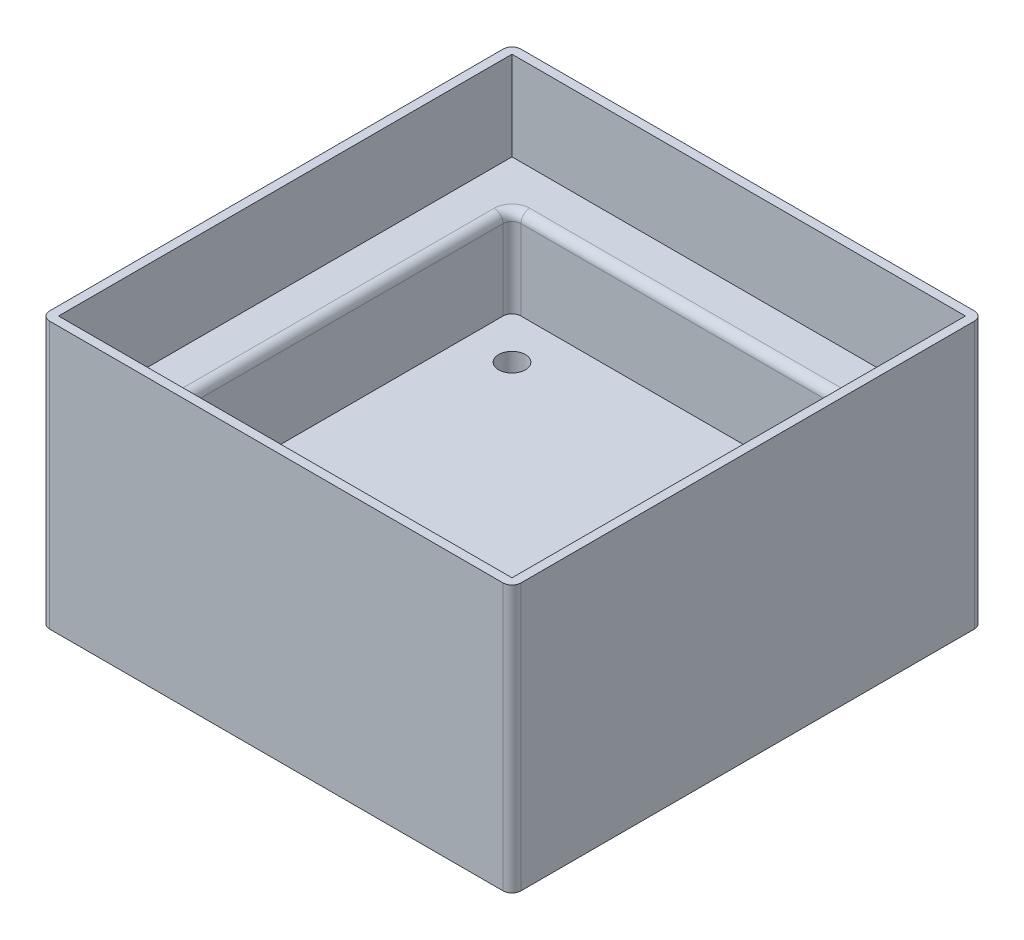
ISO-10303-21;
HEADER;
FILE_DESCRIPTION(('STEP AP214'),'2;1');
FILE_NAME('part.step','',(''),(''),'','','');
FILE_SCHEMA(('AUTOMOTIVE_DESIGN { 1 0 10303 214 1 1 1 1 }'));
ENDSEC;
DATA;
#1=APPLICATION_CONTEXT('core data for automotive mechanical design processes');
#2=APPLICATION_PROTOCOL_DEFINITION('international standard','automotive_design',2000,#1);
#3=PRODUCT_CONTEXT('',#1,'mechanical');
#4=PRODUCT('Part','Part','',(#3));
#5=PRODUCT_RELATED_PRODUCT_CATEGORY('part','',(#4));
#6=PRODUCT_DEFINITION_FORMATION('','',#4);
#7=PRODUCT_DEFINITION_CONTEXT('part definition',#1,'design');
#8=PRODUCT_DEFINITION('design','',#6,#7);
#9=PRODUCT_DEFINITION_SHAPE('','',#8);
#10=(LENGTH_UNIT() NAMED_UNIT(*) SI_UNIT(.MILLI.,.METRE.));
#11=(NAMED_UNIT(*) PLANE_ANGLE_UNIT() SI_UNIT($,.RADIAN.));
#12=(NAMED_UNIT(*) SI_UNIT($,.STERADIAN.) SOLID_ANGLE_UNIT());
#13=UNCERTAINTY_MEASURE_WITH_UNIT(LENGTH_MEASURE(1.E-05),#10,'distance_accuracy_value','');
#14=(GEOMETRIC_REPRESENTATION_CONTEXT(3) GLOBAL_UNCERTAINTY_ASSIGNED_CONTEXT((#13)) GLOBAL_UNIT_ASSIGNED_CONTEXT((#10,
#11,#12)) REPRESENTATION_CONTEXT('',''));
#15=CARTESIAN_POINT('',(0.,0.,0.));
#16=DIRECTION('',(0.,0.,1.));
#17=DIRECTION('',(1.,0.,0.));
#18=AXIS2_PLACEMENT_3D('',#15,#16,#17);
#19=CARTESIAN_POINT('',(0.,20.,0.));
#20=DIRECTION('',(0.,1.,0.));
#21=DIRECTION('',(0.,0.,1.));
#22=AXIS2_PLACEMENT_3D('',#19,#20,#21);
#23=PLANE('',#22);
#24=DIRECTION('',(0.,0.,1.));
#25=VECTOR('',#24,1.);
#26=CARTESIAN_POINT('',(0.999999999999999,20.,1.));
#27=LINE('',#26,#25);
#28=CARTESIAN_POINT('',(0.999999999999999,20.,1.));
#29=VERTEX_POINT('',#28);
#30=CARTESIAN_POINT('',(1.00000000000001,20.,52.));
#31=VERTEX_POINT('',#30);
#32=EDGE_CURVE('E200',#29,#31,#27,.T.);
#33=ORIENTED_EDGE('',*,*,#32,.T.);
#34=DIRECTION('',(1.,0.,0.));
#35=VECTOR('',#34,1.);
#36=CARTESIAN_POINT('',(1.00000000000001,20.,52.));
#37=LINE('',#36,#35);
#38=CARTESIAN_POINT('',(52.,20.,52.));
#39=VERTEX_POINT('',#38);
#40=EDGE_CURVE('E211',#31,#39,#37,.T.);
#41=ORIENTED_EDGE('',*,*,#40,.T.);
#42=DIRECTION('',(0.,0.,-1.));
#43=VECTOR('',#42,1.);
#44=CARTESIAN_POINT('',(52.,20.,1.));
#45=LINE('',#44,#43);
#46=CARTESIAN_POINT('',(52.,20.,1.));
#47=VERTEX_POINT('',#46);
#48=EDGE_CURVE('E216',#39,#47,#45,.T.);
#49=ORIENTED_EDGE('',*,*,#48,.T.);
#50=DIRECTION('',(-1.,0.,0.));
#51=VECTOR('',#50,1.);
#52=CARTESIAN_POINT('',(0.999999999999999,20.,1.));
#53=LINE('',#52,#51);
#54=EDGE_CURVE('E208',#47,#29,#53,.T.);
#55=ORIENTED_EDGE('',*,*,#54,.T.);
#56=EDGE_LOOP('',(#33,#41,#49,#55));
#57=FACE_BOUND('',#56,.T.);
#58=CARTESIAN_POINT('',(46.,20.,46.));
#59=DIRECTION('',(0.,1.,0.));
#60=DIRECTION('',(0.,0.,1.));
#61=AXIS2_PLACEMENT_3D('',#58,#59,#60);
#62=CIRCLE('',#61,2.);
#63=CARTESIAN_POINT('',(46.,20.,48.));
#64=VERTEX_POINT('',#63);
#65=CARTESIAN_POINT('',(48.,20.,46.));
#66=VERTEX_POINT('',#65);
#67=EDGE_CURVE('E312',#64,#66,#62,.T.);
#68=ORIENTED_EDGE('',*,*,#67,.F.);
#69=DIRECTION('',(1.,0.,0.));
#70=VECTOR('',#69,1.);
#71=CARTESIAN_POINT('',(6.00000000000001,20.,48.));
#72=LINE('',#71,#70);
#73=CARTESIAN_POINT('',(7.00000000000001,20.,48.));
#74=VERTEX_POINT('',#73);
#75=EDGE_CURVE('E309',#64,#74,#72,.F.);
#76=ORIENTED_EDGE('',*,*,#75,.T.);
#77=CARTESIAN_POINT('',(7.00000000000001,20.,46.));
#78=DIRECTION('',(0.,1.,0.));
#79=DIRECTION('',(0.,0.,1.));
#80=AXIS2_PLACEMENT_3D('',#77,#78,#79);
#81=CIRCLE('',#80,2.);
#82=CARTESIAN_POINT('',(5.00000000000001,20.,46.));
#83=VERTEX_POINT('',#82);
#84=EDGE_CURVE('E307',#83,#74,#81,.T.);
#85=ORIENTED_EDGE('',*,*,#84,.F.);
#86=DIRECTION('',(0.,0.,1.));
#87=VECTOR('',#86,1.);
#88=CARTESIAN_POINT('',(5.,20.,6.));
#89=LINE('',#88,#87);
#90=CARTESIAN_POINT('',(5.,20.,7.));
#91=VERTEX_POINT('',#90);
#92=EDGE_CURVE('E303',#83,#91,#89,.F.);
#93=ORIENTED_EDGE('',*,*,#92,.T.);
#94=CARTESIAN_POINT('',(7.,20.,7.));
#95=DIRECTION('',(0.,1.,0.));
#96=DIRECTION('',(0.,0.,1.));
#97=AXIS2_PLACEMENT_3D('',#94,#95,#96);
#98=CIRCLE('',#97,2.);
#99=CARTESIAN_POINT('',(7.,20.,5.));
#100=VERTEX_POINT('',#99);
#101=EDGE_CURVE('E300',#100,#91,#98,.T.);
#102=ORIENTED_EDGE('',*,*,#101,.F.);
#103=DIRECTION('',(-1.,0.,0.));
#104=VECTOR('',#103,1.);
#105=CARTESIAN_POINT('',(47.,20.,5.));
#106=LINE('',#105,#104);
#107=CARTESIAN_POINT('',(46.,20.,5.));
#108=VERTEX_POINT('',#107);
#109=EDGE_CURVE('E298',#100,#108,#106,.F.);
#110=ORIENTED_EDGE('',*,*,#109,.T.);
#111=CARTESIAN_POINT('',(46.,20.,7.));
#112=DIRECTION('',(0.,1.,0.));
#113=DIRECTION('',(0.,0.,1.));
#114=AXIS2_PLACEMENT_3D('',#111,#112,#113);
#115=CIRCLE('',#114,2.);
#116=CARTESIAN_POINT('',(48.,20.,7.));
#117=VERTEX_POINT('',#116);
#118=EDGE_CURVE('E295',#117,#108,#115,.T.);
#119=ORIENTED_EDGE('',*,*,#118,.F.);
#120=DIRECTION('',(0.,0.,-1.));
#121=VECTOR('',#120,1.);
#122=CARTESIAN_POINT('',(48.,20.,47.));
#123=LINE('',#122,#121);
#124=EDGE_CURVE('E305',#117,#66,#123,.F.);
#125=ORIENTED_EDGE('',*,*,#124,.T.);
#126=EDGE_LOOP('',(#68,#76,#85,#93,#102,#110,#119,#125));
#127=FACE_BOUND('',#126,.T.);
#128=ADVANCED_FACE('F33',(#57,#127),#23,.T.);
#129=CARTESIAN_POINT('',(0.,30.,0.));
#130=DIRECTION('',(1.,0.,0.));
#131=DIRECTION('',(0.,0.,-1.));
#132=AXIS2_PLACEMENT_3D('',#129,#130,#131);
#133=PLANE('',#132);
#134=DIRECTION('',(0.,0.,1.));
#135=VECTOR('',#134,1.);
#136=CARTESIAN_POINT('',(0.,30.,0.));
#137=LINE('',#136,#135);
#138=CARTESIAN_POINT('',(0.,30.,1.));
#139=VERTEX_POINT('',#138);
#140=CARTESIAN_POINT('',(0.,30.,52.));
#141=VERTEX_POINT('',#140);
#142=EDGE_CURVE('E242',#139,#141,#137,.T.);
#143=ORIENTED_EDGE('',*,*,#142,.F.);
#144=DIRECTION('',(0.,-1.,0.));
#145=VECTOR('',#144,1.);
#146=CARTESIAN_POINT('',(0.,30.,1.));
#147=LINE('',#146,#145);
#148=CARTESIAN_POINT('',(0.,0.,1.));
#149=VERTEX_POINT('',#148);
#150=EDGE_CURVE('E317',#139,#149,#147,.T.);
#151=ORIENTED_EDGE('',*,*,#150,.T.);
#152=DIRECTION('',(0.,0.,1.));
#153=VECTOR('',#152,1.);
#154=CARTESIAN_POINT('',(0.,0.,0.));
#155=LINE('',#154,#153);
#156=CARTESIAN_POINT('',(0.,0.,52.));
#157=VERTEX_POINT('',#156);
#158=EDGE_CURVE('E238',#149,#157,#155,.T.);
#159=ORIENTED_EDGE('',*,*,#158,.T.);
#160=DIRECTION('',(0.,-1.,0.));
#161=VECTOR('',#160,1.);
#162=CARTESIAN_POINT('',(0.,30.,52.));
#163=LINE('',#162,#161);
#164=EDGE_CURVE('E315',#157,#141,#163,.F.);
#165=ORIENTED_EDGE('',*,*,#164,.T.);
#166=EDGE_LOOP('',(#143,#151,#159,#165));
#167=FACE_BOUND('',#166,.T.);
#168=ADVANCED_FACE('F483',(#167),#133,.F.);
#169=CARTESIAN_POINT('',(0.,30.,53.));
#170=DIRECTION('',(0.,0.,-1.));
#171=DIRECTION('',(-1.,0.,0.));
#172=AXIS2_PLACEMENT_3D('',#169,#170,#171);
#173=PLANE('',#172);
#174=DIRECTION('',(1.,0.,0.));
#175=VECTOR('',#174,1.);
#176=CARTESIAN_POINT('',(0.,30.,53.));
#177=LINE('',#176,#175);
#178=CARTESIAN_POINT('',(1.00000000000001,30.,53.));
#179=VERTEX_POINT('',#178);
#180=CARTESIAN_POINT('',(52.,30.,53.));
#181=VERTEX_POINT('',#180);
#182=EDGE_CURVE('E245',#179,#181,#177,.T.);
#183=ORIENTED_EDGE('',*,*,#182,.F.);
#184=DIRECTION('',(0.,-1.,0.));
#185=VECTOR('',#184,1.);
#186=CARTESIAN_POINT('',(1.00000000000001,30.,53.));
#187=LINE('',#186,#185);
#188=CARTESIAN_POINT('',(1.00000000000001,0.,53.));
#189=VERTEX_POINT('',#188);
#190=EDGE_CURVE('E342',#179,#189,#187,.T.);
#191=ORIENTED_EDGE('',*,*,#190,.T.);
#192=DIRECTION('',(1.,0.,0.));
#193=VECTOR('',#192,1.);
#194=CARTESIAN_POINT('',(0.,0.,53.));
#195=LINE('',#194,#193);
#196=CARTESIAN_POINT('',(52.,0.,53.));
#197=VERTEX_POINT('',#196);
#198=EDGE_CURVE('E256',#189,#197,#195,.T.);
#199=ORIENTED_EDGE('',*,*,#198,.T.);
#200=DIRECTION('',(0.,-1.,0.));
#201=VECTOR('',#200,1.);
#202=CARTESIAN_POINT('',(52.,30.,53.));
#203=LINE('',#202,#201);
#204=EDGE_CURVE('E340',#197,#181,#203,.F.);
#205=ORIENTED_EDGE('',*,*,#204,.T.);
#206=EDGE_LOOP('',(#183,#191,#199,#205));
#207=FACE_BOUND('',#206,.T.);
#208=ADVANCED_FACE('F488',(#207),#173,.F.);
#209=CARTESIAN_POINT('',(53.,30.,0.));
#210=DIRECTION('',(-1.,0.,0.));
#211=DIRECTION('',(0.,0.,1.));
#212=AXIS2_PLACEMENT_3D('',#209,#210,#211);
#213=PLANE('',#212);
#214=DIRECTION('',(0.,0.,-1.));
#215=VECTOR('',#214,1.);
#216=CARTESIAN_POINT('',(53.,0.,0.));
#217=LINE('',#216,#215);
#218=CARTESIAN_POINT('',(53.,0.,52.));
#219=VERTEX_POINT('',#218);
#220=CARTESIAN_POINT('',(53.,0.,1.));
#221=VERTEX_POINT('',#220);
#222=EDGE_CURVE('E259',#219,#221,#217,.T.);
#223=ORIENTED_EDGE('',*,*,#222,.T.);
#224=DIRECTION('',(0.,-1.,0.));
#225=VECTOR('',#224,1.);
#226=CARTESIAN_POINT('',(53.,30.,1.));
#227=LINE('',#226,#225);
#228=CARTESIAN_POINT('',(53.,30.,1.));
#229=VERTEX_POINT('',#228);
#230=EDGE_CURVE('E11',#221,#229,#227,.F.);
#231=ORIENTED_EDGE('',*,*,#230,.T.);
#232=DIRECTION('',(0.,0.,-1.));
#233=VECTOR('',#232,1.);
#234=CARTESIAN_POINT('',(53.,30.,0.));
#235=LINE('',#234,#233);
#236=CARTESIAN_POINT('',(53.,30.,52.));
#237=VERTEX_POINT('',#236);
#238=EDGE_CURVE('E248',#237,#229,#235,.T.);
#239=ORIENTED_EDGE('',*,*,#238,.F.);
#240=DIRECTION('',(0.,-1.,0.));
#241=VECTOR('',#240,1.);
#242=CARTESIAN_POINT('',(53.,30.,52.));
#243=LINE('',#242,#241);
#244=EDGE_CURVE('E42',#237,#219,#243,.T.);
#245=ORIENTED_EDGE('',*,*,#244,.T.);
#246=EDGE_LOOP('',(#223,#231,#239,#245));
#247=FACE_BOUND('',#246,.T.);
#248=ADVANCED_FACE('F516',(#247),#213,.F.);
#249=CARTESIAN_POINT('',(0.,30.,0.));
#250=DIRECTION('',(0.,0.,1.));
#251=DIRECTION('',(1.,0.,0.));
#252=AXIS2_PLACEMENT_3D('',#249,#250,#251);
#253=PLANE('',#252);
#254=DIRECTION('',(-1.,0.,0.));
#255=VECTOR('',#254,1.);
#256=CARTESIAN_POINT('',(0.,0.,0.));
#257=LINE('',#256,#255);
#258=CARTESIAN_POINT('',(52.,0.,0.));
#259=VERTEX_POINT('',#258);
#260=CARTESIAN_POINT('',(1.,0.,0.));
#261=VERTEX_POINT('',#260);
#262=EDGE_CURVE('E246',#259,#261,#257,.T.);
#263=ORIENTED_EDGE('',*,*,#262,.T.);
#264=DIRECTION('',(0.,-1.,0.));
#265=VECTOR('',#264,1.);
#266=CARTESIAN_POINT('',(1.,30.,0.));
#267=LINE('',#266,#265);
#268=CARTESIAN_POINT('',(1.,30.,0.));
#269=VERTEX_POINT('',#268);
#270=EDGE_CURVE('E331',#261,#269,#267,.F.);
#271=ORIENTED_EDGE('',*,*,#270,.T.);
#272=DIRECTION('',(-1.,0.,0.));
#273=VECTOR('',#272,1.);
#274=CARTESIAN_POINT('',(0.,30.,0.));
#275=LINE('',#274,#273);
#276=CARTESIAN_POINT('',(52.,30.,0.));
#277=VERTEX_POINT('',#276);
#278=EDGE_CURVE('E250',#277,#269,#275,.T.);
#279=ORIENTED_EDGE('',*,*,#278,.F.);
#280=DIRECTION('',(0.,-1.,0.));
#281=VECTOR('',#280,1.);
#282=CARTESIAN_POINT('',(52.,30.,0.));
#283=LINE('',#282,#281);
#284=EDGE_CURVE('E328',#277,#259,#283,.T.);
#285=ORIENTED_EDGE('',*,*,#284,.T.);
#286=EDGE_LOOP('',(#263,#271,#279,#285));
#287=FACE_BOUND('',#286,.T.);
#288=ADVANCED_FACE('F509',(#287),#253,.F.);
#289=CARTESIAN_POINT('',(0.,30.,0.));
#290=DIRECTION('',(0.,1.,0.));
#291=DIRECTION('',(0.,0.,1.));
#292=AXIS2_PLACEMENT_3D('',#289,#290,#291);
#293=PLANE('',#292);
#294=DIRECTION('',(0.,0.,1.));
#295=VECTOR('',#294,1.);
#296=CARTESIAN_POINT('',(0.999999999999999,30.,1.));
#297=LINE('',#296,#295);
#298=CARTESIAN_POINT('',(0.999999999999999,30.,1.));
#299=VERTEX_POINT('',#298);
#300=CARTESIAN_POINT('',(1.00000000000001,30.,52.));
#301=VERTEX_POINT('',#300);
#302=EDGE_CURVE('E203',#299,#301,#297,.T.);
#303=ORIENTED_EDGE('',*,*,#302,.F.);
#304=DIRECTION('',(-1.,0.,0.));
#305=VECTOR('',#304,1.);
#306=CARTESIAN_POINT('',(0.999999999999999,30.,1.));
#307=LINE('',#306,#305);
#308=CARTESIAN_POINT('',(52.,30.,1.));
#309=VERTEX_POINT('',#308);
#310=EDGE_CURVE('E220',#309,#299,#307,.T.);
#311=ORIENTED_EDGE('',*,*,#310,.F.);
#312=DIRECTION('',(0.,0.,-1.));
#313=VECTOR('',#312,1.);
#314=CARTESIAN_POINT('',(52.,30.,1.));
#315=LINE('',#314,#313);
#316=CARTESIAN_POINT('',(52.,30.,52.));
#317=VERTEX_POINT('',#316);
#318=EDGE_CURVE('E223',#317,#309,#315,.T.);
#319=ORIENTED_EDGE('',*,*,#318,.F.);
#320=DIRECTION('',(1.,0.,0.));
#321=VECTOR('',#320,1.);
#322=CARTESIAN_POINT('',(1.00000000000001,30.,52.));
#323=LINE('',#322,#321);
#324=EDGE_CURVE('E232',#301,#317,#323,.T.);
#325=ORIENTED_EDGE('',*,*,#324,.F.);
#326=EDGE_LOOP('',(#303,#311,#319,#325));
#327=FACE_BOUND('',#326,.T.);
#328=ORIENTED_EDGE('',*,*,#278,.T.);
#329=CARTESIAN_POINT('',(1.,30.,1.));
#330=DIRECTION('',(0.,1.,0.));
#331=DIRECTION('',(0.,0.,1.));
#332=AXIS2_PLACEMENT_3D('',#329,#330,#331);
#333=CIRCLE('',#332,1.);
#334=EDGE_CURVE('E338',#269,#139,#333,.T.);
#335=ORIENTED_EDGE('',*,*,#334,.T.);
#336=ORIENTED_EDGE('',*,*,#142,.T.);
#337=CARTESIAN_POINT('',(1.00000000000001,30.,52.));
#338=DIRECTION('',(0.,1.,0.));
#339=DIRECTION('',(0.,0.,1.));
#340=AXIS2_PLACEMENT_3D('',#337,#338,#339);
#341=CIRCLE('',#340,1.);
#342=EDGE_CURVE('E336',#141,#179,#341,.T.);
#343=ORIENTED_EDGE('',*,*,#342,.T.);
#344=ORIENTED_EDGE('',*,*,#182,.T.);
#345=CARTESIAN_POINT('',(52.,30.,52.));
#346=DIRECTION('',(0.,1.,0.));
#347=DIRECTION('',(0.,0.,1.));
#348=AXIS2_PLACEMENT_3D('',#345,#346,#347);
#349=CIRCLE('',#348,1.);
#350=EDGE_CURVE('E55',#181,#237,#349,.T.);
#351=ORIENTED_EDGE('',*,*,#350,.T.);
#352=ORIENTED_EDGE('',*,*,#238,.T.);
#353=CARTESIAN_POINT('',(52.,30.,1.));
#354=DIRECTION('',(0.,1.,0.));
#355=DIRECTION('',(0.,0.,1.));
#356=AXIS2_PLACEMENT_3D('',#353,#354,#355);
#357=CIRCLE('',#356,1.);
#358=EDGE_CURVE('E334',#229,#277,#357,.T.);
#359=ORIENTED_EDGE('',*,*,#358,.T.);
#360=EDGE_LOOP('',(#328,#335,#336,#343,#344,#351,#352,#359));
#361=FACE_BOUND('',#360,.T.);
#362=ADVANCED_FACE('F506',(#327,#361),#293,.T.);
#363=CARTESIAN_POINT('',(0.,0.,0.));
#364=DIRECTION('',(0.,1.,0.));
#365=DIRECTION('',(0.,0.,1.));
#366=AXIS2_PLACEMENT_3D('',#363,#364,#365);
#367=PLANE('',#366);
#368=CARTESIAN_POINT('',(11.,0.,42.));
#369=DIRECTION('',(0.,1.,0.));
#370=DIRECTION('',(0.,0.,1.));
#371=AXIS2_PLACEMENT_3D('',#368,#369,#370);
#372=CIRCLE('',#371,1.5);
#373=CARTESIAN_POINT('',(11.,0.,43.5));
#374=VERTEX_POINT('',#373);
#375=EDGE_CURVE('E387',#374,#374,#372,.T.);
#376=ORIENTED_EDGE('',*,*,#375,.T.);
#377=EDGE_LOOP('',(#376));
#378=FACE_BOUND('',#377,.T.);
#379=CARTESIAN_POINT('',(42.,0.,42.));
#380=DIRECTION('',(0.,1.,0.));
#381=DIRECTION('',(0.,0.,1.));
#382=AXIS2_PLACEMENT_3D('',#379,#380,#381);
#383=CIRCLE('',#382,1.5);
#384=CARTESIAN_POINT('',(42.,0.,43.5));
#385=VERTEX_POINT('',#384);
#386=EDGE_CURVE('E395',#385,#385,#383,.T.);
#387=ORIENTED_EDGE('',*,*,#386,.T.);
#388=EDGE_LOOP('',(#387));
#389=FACE_BOUND('',#388,.T.);
#390=CARTESIAN_POINT('',(42.,0.,11.));
#391=DIRECTION('',(0.,1.,0.));
#392=DIRECTION('',(0.,0.,1.));
#393=AXIS2_PLACEMENT_3D('',#390,#391,#392);
#394=CIRCLE('',#393,1.5);
#395=CARTESIAN_POINT('',(42.,0.,12.5));
#396=VERTEX_POINT('',#395);
#397=EDGE_CURVE('E401',#396,#396,#394,.T.);
#398=ORIENTED_EDGE('',*,*,#397,.T.);
#399=EDGE_LOOP('',(#398));
#400=FACE_BOUND('',#399,.T.);
#401=CARTESIAN_POINT('',(11.,0.,11.));
#402=DIRECTION('',(0.,1.,0.));
#403=DIRECTION('',(0.,0.,1.));
#404=AXIS2_PLACEMENT_3D('',#401,#402,#403);
#405=CIRCLE('',#404,1.5);
#406=CARTESIAN_POINT('',(11.,0.,12.5));
#407=VERTEX_POINT('',#406);
#408=EDGE_CURVE('E407',#407,#407,#405,.T.);
#409=ORIENTED_EDGE('',*,*,#408,.T.);
#410=EDGE_LOOP('',(#409));
#411=FACE_BOUND('',#410,.T.);
#412=ORIENTED_EDGE('',*,*,#158,.F.);
#413=CARTESIAN_POINT('',(1.,0.,1.));
#414=DIRECTION('',(0.,1.,0.));
#415=DIRECTION('',(0.,0.,1.));
#416=AXIS2_PLACEMENT_3D('',#413,#414,#415);
#417=CIRCLE('',#416,1.);
#418=EDGE_CURVE('E326',#149,#261,#417,.F.);
#419=ORIENTED_EDGE('',*,*,#418,.T.);
#420=ORIENTED_EDGE('',*,*,#262,.F.);
#421=CARTESIAN_POINT('',(52.,0.,1.));
#422=DIRECTION('',(0.,1.,0.));
#423=DIRECTION('',(0.,0.,1.));
#424=AXIS2_PLACEMENT_3D('',#421,#422,#423);
#425=CIRCLE('',#424,1.);
#426=EDGE_CURVE('E322',#259,#221,#425,.F.);
#427=ORIENTED_EDGE('',*,*,#426,.T.);
#428=ORIENTED_EDGE('',*,*,#222,.F.);
#429=CARTESIAN_POINT('',(52.,0.,52.));
#430=DIRECTION('',(0.,1.,0.));
#431=DIRECTION('',(0.,0.,1.));
#432=AXIS2_PLACEMENT_3D('',#429,#430,#431);
#433=CIRCLE('',#432,1.);
#434=EDGE_CURVE('E320',#219,#197,#433,.F.);
#435=ORIENTED_EDGE('',*,*,#434,.T.);
#436=ORIENTED_EDGE('',*,*,#198,.F.);
#437=CARTESIAN_POINT('',(1.00000000000001,0.,52.));
#438=DIRECTION('',(0.,1.,0.));
#439=DIRECTION('',(0.,0.,1.));
#440=AXIS2_PLACEMENT_3D('',#437,#438,#439);
#441=CIRCLE('',#440,1.);
#442=EDGE_CURVE('E324',#189,#157,#441,.F.);
#443=ORIENTED_EDGE('',*,*,#442,.T.);
#444=EDGE_LOOP('',(#412,#419,#420,#427,#428,#435,#436,#443));
#445=FACE_BOUND('',#444,.T.);
#446=ADVANCED_FACE('F505',(#378,#389,#400,#411,#445),#367,.F.);
#447=CARTESIAN_POINT('',(0.999999999999999,20.,1.));
#448=DIRECTION('',(-1.,0.,0.));
#449=DIRECTION('',(0.,0.,1.));
#450=AXIS2_PLACEMENT_3D('',#447,#448,#449);
#451=PLANE('',#450);
#452=ORIENTED_EDGE('',*,*,#302,.T.);
#453=DIRECTION('',(0.,1.,0.));
#454=VECTOR('',#453,1.);
#455=CARTESIAN_POINT('',(1.00000000000001,20.,52.));
#456=LINE('',#455,#454);
#457=EDGE_CURVE('E196',#31,#301,#456,.T.);
#458=ORIENTED_EDGE('',*,*,#457,.F.);
#459=ORIENTED_EDGE('',*,*,#32,.F.);
#460=DIRECTION('',(0.,1.,0.));
#461=VECTOR('',#460,1.);
#462=CARTESIAN_POINT('',(0.999999999999999,20.,1.));
#463=LINE('',#462,#461);
#464=EDGE_CURVE('E236',#29,#299,#463,.T.);
#465=ORIENTED_EDGE('',*,*,#464,.T.);
#466=EDGE_LOOP('',(#452,#458,#459,#465));
#467=FACE_BOUND('',#466,.T.);
#468=ADVANCED_FACE('F198',(#467),#451,.F.);
#469=CARTESIAN_POINT('',(0.999999999999999,20.,1.));
#470=DIRECTION('',(0.,0.,-1.));
#471=DIRECTION('',(-1.,0.,0.));
#472=AXIS2_PLACEMENT_3D('',#469,#470,#471);
#473=PLANE('',#472);
#474=ORIENTED_EDGE('',*,*,#310,.T.);
#475=ORIENTED_EDGE('',*,*,#464,.F.);
#476=ORIENTED_EDGE('',*,*,#54,.F.);
#477=DIRECTION('',(0.,1.,0.));
#478=VECTOR('',#477,1.);
#479=CARTESIAN_POINT('',(52.,20.,1.));
#480=LINE('',#479,#478);
#481=EDGE_CURVE('E239',#47,#309,#480,.T.);
#482=ORIENTED_EDGE('',*,*,#481,.T.);
#483=EDGE_LOOP('',(#474,#475,#476,#482));
#484=FACE_BOUND('',#483,.T.);
#485=ADVANCED_FACE('F493',(#484),#473,.F.);
#486=CARTESIAN_POINT('',(52.,20.,1.));
#487=DIRECTION('',(1.,0.,0.));
#488=DIRECTION('',(0.,0.,-1.));
#489=AXIS2_PLACEMENT_3D('',#486,#487,#488);
#490=PLANE('',#489);
#491=ORIENTED_EDGE('',*,*,#318,.T.);
#492=ORIENTED_EDGE('',*,*,#481,.F.);
#493=ORIENTED_EDGE('',*,*,#48,.F.);
#494=DIRECTION('',(0.,1.,0.));
#495=VECTOR('',#494,1.);
#496=CARTESIAN_POINT('',(52.,20.,52.));
#497=LINE('',#496,#495);
#498=EDGE_CURVE('E207',#39,#317,#497,.T.);
#499=ORIENTED_EDGE('',*,*,#498,.T.);
#500=EDGE_LOOP('',(#491,#492,#493,#499));
#501=FACE_BOUND('',#500,.T.);
#502=ADVANCED_FACE('F496',(#501),#490,.F.);
#503=CARTESIAN_POINT('',(1.00000000000001,20.,52.));
#504=DIRECTION('',(0.,0.,1.));
#505=DIRECTION('',(1.,0.,0.));
#506=AXIS2_PLACEMENT_3D('',#503,#504,#505);
#507=PLANE('',#506);
#508=ORIENTED_EDGE('',*,*,#324,.T.);
#509=ORIENTED_EDGE('',*,*,#498,.F.);
#510=ORIENTED_EDGE('',*,*,#40,.F.);
#511=ORIENTED_EDGE('',*,*,#457,.T.);
#512=EDGE_LOOP('',(#508,#509,#510,#511));
#513=FACE_BOUND('',#512,.T.);
#514=ADVANCED_FACE('F212',(#513),#507,.F.);
#515=CARTESIAN_POINT('',(47.,10.,6.));
#516=DIRECTION('',(0.,0.,-1.));
#517=DIRECTION('',(-1.,0.,0.));
#518=AXIS2_PLACEMENT_3D('',#515,#516,#517);
#519=PLANE('',#518);
#520=DIRECTION('',(-1.,0.,0.));
#521=VECTOR('',#520,1.);
#522=CARTESIAN_POINT('',(47.,10.,6.));
#523=LINE('',#522,#521);
#524=CARTESIAN_POINT('',(46.,10.,6.));
#525=VERTEX_POINT('',#524);
#526=CARTESIAN_POINT('',(7.,10.,6.));
#527=VERTEX_POINT('',#526);
#528=EDGE_CURVE('E410',#525,#527,#523,.T.);
#529=ORIENTED_EDGE('',*,*,#528,.F.);
#530=DIRECTION('',(0.,1.,0.));
#531=VECTOR('',#530,1.);
#532=CARTESIAN_POINT('',(46.,20.,6.));
#533=LINE('',#532,#531);
#534=CARTESIAN_POINT('',(46.,19.,6.));
#535=VERTEX_POINT('',#534);
#536=EDGE_CURVE('E293',#525,#535,#533,.T.);
#537=ORIENTED_EDGE('',*,*,#536,.T.);
#538=DIRECTION('',(-1.,0.,0.));
#539=VECTOR('',#538,1.);
#540=CARTESIAN_POINT('',(6.,19.,6.));
#541=LINE('',#540,#539);
#542=CARTESIAN_POINT('',(7.,19.,6.));
#543=VERTEX_POINT('',#542);
#544=EDGE_CURVE('E289',#535,#543,#541,.T.);
#545=ORIENTED_EDGE('',*,*,#544,.T.);
#546=DIRECTION('',(0.,1.,0.));
#547=VECTOR('',#546,1.);
#548=CARTESIAN_POINT('',(7.,10.,6.));
#549=LINE('',#548,#547);
#550=EDGE_CURVE('E291',#543,#527,#549,.F.);
#551=ORIENTED_EDGE('',*,*,#550,.T.);
#552=EDGE_LOOP('',(#529,#537,#545,#551));
#553=FACE_BOUND('',#552,.T.);
#554=ADVANCED_FACE('F434',(#553),#519,.F.);
#555=CARTESIAN_POINT('',(47.,10.,47.));
#556=DIRECTION('',(1.,0.,0.));
#557=DIRECTION('',(0.,0.,-1.));
#558=AXIS2_PLACEMENT_3D('',#555,#556,#557);
#559=PLANE('',#558);
#560=DIRECTION('',(0.,0.,-1.));
#561=VECTOR('',#560,1.);
#562=CARTESIAN_POINT('',(47.,10.,47.));
#563=LINE('',#562,#561);
#564=CARTESIAN_POINT('',(47.,10.,46.));
#565=VERTEX_POINT('',#564);
#566=CARTESIAN_POINT('',(47.,10.,7.));
#567=VERTEX_POINT('',#566);
#568=EDGE_CURVE('E226',#565,#567,#563,.T.);
#569=ORIENTED_EDGE('',*,*,#568,.F.);
#570=DIRECTION('',(0.,1.,0.));
#571=VECTOR('',#570,1.);
#572=CARTESIAN_POINT('',(47.,20.,46.));
#573=LINE('',#572,#571);
#574=CARTESIAN_POINT('',(47.,19.,46.));
#575=VERTEX_POINT('',#574);
#576=EDGE_CURVE('E287',#565,#575,#573,.T.);
#577=ORIENTED_EDGE('',*,*,#576,.T.);
#578=DIRECTION('',(0.,0.,-1.));
#579=VECTOR('',#578,1.);
#580=CARTESIAN_POINT('',(47.,19.,6.));
#581=LINE('',#580,#579);
#582=CARTESIAN_POINT('',(47.,19.,7.));
#583=VERTEX_POINT('',#582);
#584=EDGE_CURVE('E283',#575,#583,#581,.T.);
#585=ORIENTED_EDGE('',*,*,#584,.T.);
#586=DIRECTION('',(0.,1.,0.));
#587=VECTOR('',#586,1.);
#588=CARTESIAN_POINT('',(47.,10.,7.));
#589=LINE('',#588,#587);
#590=EDGE_CURVE('E285',#583,#567,#589,.F.);
#591=ORIENTED_EDGE('',*,*,#590,.T.);
#592=EDGE_LOOP('',(#569,#577,#585,#591));
#593=FACE_BOUND('',#592,.T.);
#594=ADVANCED_FACE('F472',(#593),#559,.F.);
#595=CARTESIAN_POINT('',(6.00000000000001,10.,47.));
#596=DIRECTION('',(0.,0.,1.));
#597=DIRECTION('',(1.,0.,0.));
#598=AXIS2_PLACEMENT_3D('',#595,#596,#597);
#599=PLANE('',#598);
#600=DIRECTION('',(1.,0.,0.));
#601=VECTOR('',#600,1.);
#602=CARTESIAN_POINT('',(6.00000000000001,10.,47.));
#603=LINE('',#602,#601);
#604=CARTESIAN_POINT('',(7.00000000000001,10.,47.));
#605=VERTEX_POINT('',#604);
#606=CARTESIAN_POINT('',(46.,10.,47.));
#607=VERTEX_POINT('',#606);
#608=EDGE_CURVE('E417',#605,#607,#603,.T.);
#609=ORIENTED_EDGE('',*,*,#608,.F.);
#610=DIRECTION('',(0.,1.,0.));
#611=VECTOR('',#610,1.);
#612=CARTESIAN_POINT('',(7.00000000000001,20.,47.));
#613=LINE('',#612,#611);
#614=CARTESIAN_POINT('',(7.00000000000001,19.,47.));
#615=VERTEX_POINT('',#614);
#616=EDGE_CURVE('E266',#605,#615,#613,.T.);
#617=ORIENTED_EDGE('',*,*,#616,.T.);
#618=DIRECTION('',(1.,0.,0.));
#619=VECTOR('',#618,1.);
#620=CARTESIAN_POINT('',(47.,19.,47.));
#621=LINE('',#620,#619);
#622=CARTESIAN_POINT('',(46.,19.,47.));
#623=VERTEX_POINT('',#622);
#624=EDGE_CURVE('E253',#615,#623,#621,.T.);
#625=ORIENTED_EDGE('',*,*,#624,.T.);
#626=DIRECTION('',(0.,1.,0.));
#627=VECTOR('',#626,1.);
#628=CARTESIAN_POINT('',(46.,10.,47.));
#629=LINE('',#628,#627);
#630=EDGE_CURVE('E264',#623,#607,#629,.F.);
#631=ORIENTED_EDGE('',*,*,#630,.T.);
#632=EDGE_LOOP('',(#609,#617,#625,#631));
#633=FACE_BOUND('',#632,.T.);
#634=ADVANCED_FACE('F456',(#633),#599,.F.);
#635=CARTESIAN_POINT('',(6.,10.,6.));
#636=DIRECTION('',(-1.,0.,0.));
#637=DIRECTION('',(0.,0.,1.));
#638=AXIS2_PLACEMENT_3D('',#635,#636,#637);
#639=PLANE('',#638);
#640=DIRECTION('',(0.,0.,1.));
#641=VECTOR('',#640,1.);
#642=CARTESIAN_POINT('',(6.00000000000001,19.,47.));
#643=LINE('',#642,#641);
#644=CARTESIAN_POINT('',(6.,19.,7.));
#645=VERTEX_POINT('',#644);
#646=CARTESIAN_POINT('',(6.00000000000001,19.,46.));
#647=VERTEX_POINT('',#646);
#648=EDGE_CURVE('E269',#645,#647,#643,.T.);
#649=ORIENTED_EDGE('',*,*,#648,.T.);
#650=DIRECTION('',(0.,1.,0.));
#651=VECTOR('',#650,1.);
#652=CARTESIAN_POINT('',(6.00000000000001,10.,46.));
#653=LINE('',#652,#651);
#654=CARTESIAN_POINT('',(6.00000000000001,10.,46.));
#655=VERTEX_POINT('',#654);
#656=EDGE_CURVE('E273',#647,#655,#653,.F.);
#657=ORIENTED_EDGE('',*,*,#656,.T.);
#658=DIRECTION('',(0.,0.,1.));
#659=VECTOR('',#658,1.);
#660=CARTESIAN_POINT('',(6.,10.,6.));
#661=LINE('',#660,#659);
#662=CARTESIAN_POINT('',(6.,10.,7.));
#663=VERTEX_POINT('',#662);
#664=EDGE_CURVE('E415',#663,#655,#661,.T.);
#665=ORIENTED_EDGE('',*,*,#664,.F.);
#666=DIRECTION('',(0.,1.,0.));
#667=VECTOR('',#666,1.);
#668=CARTESIAN_POINT('',(6.,20.,7.));
#669=LINE('',#668,#667);
#670=EDGE_CURVE('E271',#663,#645,#669,.T.);
#671=ORIENTED_EDGE('',*,*,#670,.T.);
#672=EDGE_LOOP('',(#649,#657,#665,#671));
#673=FACE_BOUND('',#672,.T.);
#674=ADVANCED_FACE('F446',(#673),#639,.F.);
#675=CARTESIAN_POINT('',(0.,10.,0.));
#676=DIRECTION('',(0.,1.,0.));
#677=DIRECTION('',(0.,0.,1.));
#678=AXIS2_PLACEMENT_3D('',#675,#676,#677);
#679=PLANE('',#678);
#680=CARTESIAN_POINT('',(11.,10.,42.));
#681=DIRECTION('',(0.,1.,0.));
#682=DIRECTION('',(0.,0.,1.));
#683=AXIS2_PLACEMENT_3D('',#680,#681,#682);
#684=CIRCLE('',#683,1.5);
#685=CARTESIAN_POINT('',(11.,10.,43.5));
#686=VERTEX_POINT('',#685);
#687=EDGE_CURVE('E382',#686,#686,#684,.T.);
#688=ORIENTED_EDGE('',*,*,#687,.F.);
#689=EDGE_LOOP('',(#688));
#690=FACE_BOUND('',#689,.T.);
#691=CARTESIAN_POINT('',(42.,10.,42.));
#692=DIRECTION('',(0.,1.,0.));
#693=DIRECTION('',(0.,0.,1.));
#694=AXIS2_PLACEMENT_3D('',#691,#692,#693);
#695=CIRCLE('',#694,1.5);
#696=CARTESIAN_POINT('',(42.,10.,43.5));
#697=VERTEX_POINT('',#696);
#698=EDGE_CURVE('E392',#697,#697,#695,.T.);
#699=ORIENTED_EDGE('',*,*,#698,.F.);
#700=EDGE_LOOP('',(#699));
#701=FACE_BOUND('',#700,.T.);
#702=CARTESIAN_POINT('',(42.,10.,11.));
#703=DIRECTION('',(0.,1.,0.));
#704=DIRECTION('',(0.,0.,1.));
#705=AXIS2_PLACEMENT_3D('',#702,#703,#704);
#706=CIRCLE('',#705,1.5);
#707=CARTESIAN_POINT('',(42.,10.,12.5));
#708=VERTEX_POINT('',#707);
#709=EDGE_CURVE('E398',#708,#708,#706,.T.);
#710=ORIENTED_EDGE('',*,*,#709,.F.);
#711=EDGE_LOOP('',(#710));
#712=FACE_BOUND('',#711,.T.);
#713=CARTESIAN_POINT('',(11.,10.,11.));
#714=DIRECTION('',(0.,1.,0.));
#715=DIRECTION('',(0.,0.,1.));
#716=AXIS2_PLACEMENT_3D('',#713,#714,#715);
#717=CIRCLE('',#716,1.5);
#718=CARTESIAN_POINT('',(11.,10.,12.5));
#719=VERTEX_POINT('',#718);
#720=EDGE_CURVE('E404',#719,#719,#717,.T.);
#721=ORIENTED_EDGE('',*,*,#720,.F.);
#722=EDGE_LOOP('',(#721));
#723=FACE_BOUND('',#722,.T.);
#724=ORIENTED_EDGE('',*,*,#664,.T.);
#725=CARTESIAN_POINT('',(7.00000000000001,10.,46.));
#726=DIRECTION('',(0.,1.,0.));
#727=DIRECTION('',(0.,0.,1.));
#728=AXIS2_PLACEMENT_3D('',#725,#726,#727);
#729=CIRCLE('',#728,1.);
#730=EDGE_CURVE('E281',#655,#605,#729,.T.);
#731=ORIENTED_EDGE('',*,*,#730,.T.);
#732=ORIENTED_EDGE('',*,*,#608,.T.);
#733=CARTESIAN_POINT('',(46.,10.,46.));
#734=DIRECTION('',(0.,1.,0.));
#735=DIRECTION('',(0.,0.,1.));
#736=AXIS2_PLACEMENT_3D('',#733,#734,#735);
#737=CIRCLE('',#736,1.);
#738=EDGE_CURVE('E279',#607,#565,#737,.T.);
#739=ORIENTED_EDGE('',*,*,#738,.T.);
#740=ORIENTED_EDGE('',*,*,#568,.T.);
#741=CARTESIAN_POINT('',(46.,10.,7.));
#742=DIRECTION('',(0.,1.,0.));
#743=DIRECTION('',(0.,0.,1.));
#744=AXIS2_PLACEMENT_3D('',#741,#742,#743);
#745=CIRCLE('',#744,1.);
#746=EDGE_CURVE('E277',#567,#525,#745,.T.);
#747=ORIENTED_EDGE('',*,*,#746,.T.);
#748=ORIENTED_EDGE('',*,*,#528,.T.);
#749=CARTESIAN_POINT('',(7.,10.,7.));
#750=DIRECTION('',(0.,1.,0.));
#751=DIRECTION('',(0.,0.,1.));
#752=AXIS2_PLACEMENT_3D('',#749,#750,#751);
#753=CIRCLE('',#752,1.);
#754=EDGE_CURVE('E275',#527,#663,#753,.T.);
#755=ORIENTED_EDGE('',*,*,#754,.T.);
#756=EDGE_LOOP('',(#724,#731,#732,#739,#740,#747,#748,#755));
#757=FACE_BOUND('',#756,.T.);
#758=ADVANCED_FACE('F425',(#690,#701,#712,#723,#757),#679,.T.);
#759=CARTESIAN_POINT('',(11.,0.,11.));
#760=DIRECTION('',(0.,1.,0.));
#761=DIRECTION('',(0.,0.,1.));
#762=AXIS2_PLACEMENT_3D('',#759,#760,#761);
#763=CYLINDRICAL_SURFACE('',#762,1.5);
#764=ORIENTED_EDGE('',*,*,#408,.F.);
#765=EDGE_LOOP('',(#764));
#766=FACE_BOUND('',#765,.T.);
#767=ORIENTED_EDGE('',*,*,#720,.T.);
#768=EDGE_LOOP('',(#767));
#769=FACE_BOUND('',#768,.T.);
#770=ADVANCED_FACE('F690',(#766,#769),#763,.F.);
#771=CARTESIAN_POINT('',(42.,0.,11.));
#772=DIRECTION('',(0.,1.,0.));
#773=DIRECTION('',(0.,0.,1.));
#774=AXIS2_PLACEMENT_3D('',#771,#772,#773);
#775=CYLINDRICAL_SURFACE('',#774,1.5);
#776=ORIENTED_EDGE('',*,*,#397,.F.);
#777=EDGE_LOOP('',(#776));
#778=FACE_BOUND('',#777,.T.);
#779=ORIENTED_EDGE('',*,*,#709,.T.);
#780=EDGE_LOOP('',(#779));
#781=FACE_BOUND('',#780,.T.);
#782=ADVANCED_FACE('F774',(#778,#781),#775,.F.);
#783=CARTESIAN_POINT('',(42.,0.,42.));
#784=DIRECTION('',(0.,1.,0.));
#785=DIRECTION('',(0.,0.,1.));
#786=AXIS2_PLACEMENT_3D('',#783,#784,#785);
#787=CYLINDRICAL_SURFACE('',#786,1.5);
#788=ORIENTED_EDGE('',*,*,#386,.F.);
#789=EDGE_LOOP('',(#788));
#790=FACE_BOUND('',#789,.T.);
#791=ORIENTED_EDGE('',*,*,#698,.T.);
#792=EDGE_LOOP('',(#791));
#793=FACE_BOUND('',#792,.T.);
#794=ADVANCED_FACE('F764',(#790,#793),#787,.F.);
#795=CARTESIAN_POINT('',(11.,0.,42.));
#796=DIRECTION('',(0.,1.,0.));
#797=DIRECTION('',(0.,0.,1.));
#798=AXIS2_PLACEMENT_3D('',#795,#796,#797);
#799=CYLINDRICAL_SURFACE('',#798,1.5);
#800=ORIENTED_EDGE('',*,*,#375,.F.);
#801=EDGE_LOOP('',(#800));
#802=FACE_BOUND('',#801,.T.);
#803=ORIENTED_EDGE('',*,*,#687,.T.);
#804=EDGE_LOOP('',(#803));
#805=FACE_BOUND('',#804,.T.);
#806=ADVANCED_FACE('F557',(#802,#805),#799,.F.);
#807=CARTESIAN_POINT('',(46.,10.,7.));
#808=DIRECTION('',(0.,-1.,0.));
#809=DIRECTION('',(0.,0.,-1.));
#810=AXIS2_PLACEMENT_3D('',#807,#808,#809);
#811=CYLINDRICAL_SURFACE('',#810,1.);
#812=CARTESIAN_POINT('',(46.,19.,7.));
#813=DIRECTION('',(0.,1.,0.));
#814=DIRECTION('',(0.,0.,1.));
#815=AXIS2_PLACEMENT_3D('',#812,#813,#814);
#816=CIRCLE('',#815,1.);
#817=EDGE_CURVE('E37',#535,#583,#816,.F.);
#818=ORIENTED_EDGE('',*,*,#817,.F.);
#819=ORIENTED_EDGE('',*,*,#536,.F.);
#820=ORIENTED_EDGE('',*,*,#746,.F.);
#821=ORIENTED_EDGE('',*,*,#590,.F.);
#822=EDGE_LOOP('',(#818,#819,#820,#821));
#823=FACE_BOUND('',#822,.T.);
#824=ADVANCED_FACE('F432',(#823),#811,.F.);
#825=CARTESIAN_POINT('',(46.,19.,7.));
#826=DIRECTION('',(0.,1.,0.));
#827=DIRECTION('',(0.,0.,1.));
#828=AXIS2_PLACEMENT_3D('',#825,#826,#827);
#829=TOROIDAL_SURFACE('',#828,2.,1.);
#830=CARTESIAN_POINT('',(46.,19.,5.));
#831=DIRECTION('',(1.,0.,0.));
#832=DIRECTION('',(0.,0.,-1.));
#833=AXIS2_PLACEMENT_3D('',#830,#831,#832);
#834=CIRCLE('',#833,1.);
#835=EDGE_CURVE('E373',#535,#108,#834,.F.);
#836=ORIENTED_EDGE('',*,*,#835,.F.);
#837=ORIENTED_EDGE('',*,*,#817,.T.);
#838=CARTESIAN_POINT('',(48.,19.,7.));
#839=DIRECTION('',(0.,0.,-1.));
#840=DIRECTION('',(-1.,0.,0.));
#841=AXIS2_PLACEMENT_3D('',#838,#839,#840);
#842=CIRCLE('',#841,1.);
#843=EDGE_CURVE('E375',#117,#583,#842,.F.);
#844=ORIENTED_EDGE('',*,*,#843,.F.);
#845=ORIENTED_EDGE('',*,*,#118,.T.);
#846=EDGE_LOOP('',(#836,#837,#844,#845));
#847=FACE_BOUND('',#846,.T.);
#848=ADVANCED_FACE('F552',(#847),#829,.T.);
#849=CARTESIAN_POINT('',(46.,10.,46.));
#850=DIRECTION('',(0.,-1.,0.));
#851=DIRECTION('',(0.,0.,-1.));
#852=AXIS2_PLACEMENT_3D('',#849,#850,#851);
#853=CYLINDRICAL_SURFACE('',#852,1.);
#854=ORIENTED_EDGE('',*,*,#738,.F.);
#855=ORIENTED_EDGE('',*,*,#630,.F.);
#856=CARTESIAN_POINT('',(46.,19.,46.));
#857=DIRECTION('',(0.,1.,0.));
#858=DIRECTION('',(0.,0.,1.));
#859=AXIS2_PLACEMENT_3D('',#856,#857,#858);
#860=CIRCLE('',#859,1.);
#861=EDGE_CURVE('E370',#575,#623,#860,.F.);
#862=ORIENTED_EDGE('',*,*,#861,.F.);
#863=ORIENTED_EDGE('',*,*,#576,.F.);
#864=EDGE_LOOP('',(#854,#855,#862,#863));
#865=FACE_BOUND('',#864,.T.);
#866=ADVANCED_FACE('F461',(#865),#853,.F.);
#867=CARTESIAN_POINT('',(48.,19.,47.));
#868=DIRECTION('',(0.,0.,1.));
#869=DIRECTION('',(1.,0.,0.));
#870=AXIS2_PLACEMENT_3D('',#867,#868,#869);
#871=CYLINDRICAL_SURFACE('',#870,1.);
#872=ORIENTED_EDGE('',*,*,#843,.T.);
#873=ORIENTED_EDGE('',*,*,#584,.F.);
#874=CARTESIAN_POINT('',(48.,19.,46.));
#875=DIRECTION('',(0.,0.,1.));
#876=DIRECTION('',(1.,0.,0.));
#877=AXIS2_PLACEMENT_3D('',#874,#875,#876);
#878=CIRCLE('',#877,1.);
#879=EDGE_CURVE('E367',#66,#575,#878,.T.);
#880=ORIENTED_EDGE('',*,*,#879,.F.);
#881=ORIENTED_EDGE('',*,*,#124,.F.);
#882=EDGE_LOOP('',(#872,#873,#880,#881));
#883=FACE_BOUND('',#882,.T.);
#884=ADVANCED_FACE('F471',(#883),#871,.T.);
#885=CARTESIAN_POINT('',(47.,19.,5.));
#886=DIRECTION('',(1.,0.,0.));
#887=DIRECTION('',(0.,0.,-1.));
#888=AXIS2_PLACEMENT_3D('',#885,#886,#887);
#889=CYLINDRICAL_SURFACE('',#888,1.);
#890=ORIENTED_EDGE('',*,*,#835,.T.);
#891=ORIENTED_EDGE('',*,*,#109,.F.);
#892=CARTESIAN_POINT('',(7.,19.,5.));
#893=DIRECTION('',(-1.,0.,0.));
#894=DIRECTION('',(0.,0.,1.));
#895=AXIS2_PLACEMENT_3D('',#892,#893,#894);
#896=CIRCLE('',#895,1.);
#897=EDGE_CURVE('E364',#543,#100,#896,.T.);
#898=ORIENTED_EDGE('',*,*,#897,.F.);
#899=ORIENTED_EDGE('',*,*,#544,.F.);
#900=EDGE_LOOP('',(#890,#891,#898,#899));
#901=FACE_BOUND('',#900,.T.);
#902=ADVANCED_FACE('F544',(#901),#889,.T.);
#903=CARTESIAN_POINT('',(7.,10.,7.));
#904=DIRECTION('',(0.,-1.,0.));
#905=DIRECTION('',(0.,0.,-1.));
#906=AXIS2_PLACEMENT_3D('',#903,#904,#905);
#907=CYLINDRICAL_SURFACE('',#906,1.);
#908=ORIENTED_EDGE('',*,*,#754,.F.);
#909=ORIENTED_EDGE('',*,*,#550,.F.);
#910=CARTESIAN_POINT('',(7.,19.,7.));
#911=DIRECTION('',(0.,1.,0.));
#912=DIRECTION('',(0.,0.,1.));
#913=AXIS2_PLACEMENT_3D('',#910,#911,#912);
#914=CIRCLE('',#913,1.);
#915=EDGE_CURVE('E361',#645,#543,#914,.F.);
#916=ORIENTED_EDGE('',*,*,#915,.F.);
#917=ORIENTED_EDGE('',*,*,#670,.F.);
#918=EDGE_LOOP('',(#908,#909,#916,#917));
#919=FACE_BOUND('',#918,.T.);
#920=ADVANCED_FACE('F441',(#919),#907,.F.);
#921=CARTESIAN_POINT('',(46.,19.,46.));
#922=DIRECTION('',(0.,1.,0.));
#923=DIRECTION('',(0.,0.,1.));
#924=AXIS2_PLACEMENT_3D('',#921,#922,#923);
#925=TOROIDAL_SURFACE('',#924,2.,1.);
#926=ORIENTED_EDGE('',*,*,#879,.T.);
#927=ORIENTED_EDGE('',*,*,#861,.T.);
#928=CARTESIAN_POINT('',(46.,19.,48.));
#929=DIRECTION('',(1.,0.,0.));
#930=DIRECTION('',(0.,0.,-1.));
#931=AXIS2_PLACEMENT_3D('',#928,#929,#930);
#932=CIRCLE('',#931,1.);
#933=EDGE_CURVE('E358',#64,#623,#932,.F.);
#934=ORIENTED_EDGE('',*,*,#933,.F.);
#935=ORIENTED_EDGE('',*,*,#67,.T.);
#936=EDGE_LOOP('',(#926,#927,#934,#935));
#937=FACE_BOUND('',#936,.T.);
#938=ADVANCED_FACE('F464',(#937),#925,.T.);
#939=CARTESIAN_POINT('',(7.,19.,7.));
#940=DIRECTION('',(0.,1.,0.));
#941=DIRECTION('',(0.,0.,1.));
#942=AXIS2_PLACEMENT_3D('',#939,#940,#941);
#943=TOROIDAL_SURFACE('',#942,2.,1.);
#944=ORIENTED_EDGE('',*,*,#897,.T.);
#945=ORIENTED_EDGE('',*,*,#101,.T.);
#946=CARTESIAN_POINT('',(5.,19.,7.));
#947=DIRECTION('',(0.,0.,-1.));
#948=DIRECTION('',(-1.,0.,0.));
#949=AXIS2_PLACEMENT_3D('',#946,#947,#948);
#950=CIRCLE('',#949,1.);
#951=EDGE_CURVE('E355',#645,#91,#950,.F.);
#952=ORIENTED_EDGE('',*,*,#951,.F.);
#953=ORIENTED_EDGE('',*,*,#915,.T.);
#954=EDGE_LOOP('',(#944,#945,#952,#953));
#955=FACE_BOUND('',#954,.T.);
#956=ADVANCED_FACE('F536',(#955),#943,.T.);
#957=CARTESIAN_POINT('',(6.00000000000001,19.,48.));
#958=DIRECTION('',(-1.,0.,0.));
#959=DIRECTION('',(0.,0.,1.));
#960=AXIS2_PLACEMENT_3D('',#957,#958,#959);
#961=CYLINDRICAL_SURFACE('',#960,1.);
#962=ORIENTED_EDGE('',*,*,#933,.T.);
#963=ORIENTED_EDGE('',*,*,#624,.F.);
#964=CARTESIAN_POINT('',(7.00000000000001,19.,48.));
#965=DIRECTION('',(-1.,0.,0.));
#966=DIRECTION('',(0.,0.,1.));
#967=AXIS2_PLACEMENT_3D('',#964,#965,#966);
#968=CIRCLE('',#967,1.);
#969=EDGE_CURVE('E352',#74,#615,#968,.T.);
#970=ORIENTED_EDGE('',*,*,#969,.F.);
#971=ORIENTED_EDGE('',*,*,#75,.F.);
#972=EDGE_LOOP('',(#962,#963,#970,#971));
#973=FACE_BOUND('',#972,.T.);
#974=ADVANCED_FACE('F468',(#973),#961,.T.);
#975=CARTESIAN_POINT('',(5.,19.,6.));
#976=DIRECTION('',(0.,0.,-1.));
#977=DIRECTION('',(-1.,0.,0.));
#978=AXIS2_PLACEMENT_3D('',#975,#976,#977);
#979=CYLINDRICAL_SURFACE('',#978,1.);
#980=ORIENTED_EDGE('',*,*,#951,.T.);
#981=ORIENTED_EDGE('',*,*,#92,.F.);
#982=CARTESIAN_POINT('',(5.00000000000001,19.,46.));
#983=DIRECTION('',(0.,0.,1.));
#984=DIRECTION('',(1.,0.,0.));
#985=AXIS2_PLACEMENT_3D('',#982,#983,#984);
#986=CIRCLE('',#985,1.);
#987=EDGE_CURVE('E349',#647,#83,#986,.T.);
#988=ORIENTED_EDGE('',*,*,#987,.F.);
#989=ORIENTED_EDGE('',*,*,#648,.F.);
#990=EDGE_LOOP('',(#980,#981,#988,#989));
#991=FACE_BOUND('',#990,.T.);
#992=ADVANCED_FACE('F529',(#991),#979,.T.);
#993=CARTESIAN_POINT('',(7.00000000000001,19.,46.));
#994=DIRECTION('',(0.,1.,0.));
#995=DIRECTION('',(0.,0.,1.));
#996=AXIS2_PLACEMENT_3D('',#993,#994,#995);
#997=TOROIDAL_SURFACE('',#996,2.,1.);
#998=ORIENTED_EDGE('',*,*,#84,.T.);
#999=ORIENTED_EDGE('',*,*,#969,.T.);
#1000=CARTESIAN_POINT('',(7.00000000000001,19.,46.));
#1001=DIRECTION('',(0.,1.,0.));
#1002=DIRECTION('',(0.,0.,1.));
#1003=AXIS2_PLACEMENT_3D('',#1000,#1001,#1002);
#1004=CIRCLE('',#1003,1.);
#1005=EDGE_CURVE('E347',#647,#615,#1004,.T.);
#1006=ORIENTED_EDGE('',*,*,#1005,.F.);
#1007=ORIENTED_EDGE('',*,*,#987,.T.);
#1008=EDGE_LOOP('',(#998,#999,#1006,#1007));
#1009=FACE_BOUND('',#1008,.T.);
#1010=ADVANCED_FACE('F526',(#1009),#997,.T.);
#1011=CARTESIAN_POINT('',(7.00000000000001,10.,46.));
#1012=DIRECTION('',(0.,-1.,0.));
#1013=DIRECTION('',(0.,0.,-1.));
#1014=AXIS2_PLACEMENT_3D('',#1011,#1012,#1013);
#1015=CYLINDRICAL_SURFACE('',#1014,1.);
#1016=ORIENTED_EDGE('',*,*,#730,.F.);
#1017=ORIENTED_EDGE('',*,*,#656,.F.);
#1018=ORIENTED_EDGE('',*,*,#1005,.T.);
#1019=ORIENTED_EDGE('',*,*,#616,.F.);
#1020=EDGE_LOOP('',(#1016,#1017,#1018,#1019));
#1021=FACE_BOUND('',#1020,.T.);
#1022=ADVANCED_FACE('F453',(#1021),#1015,.F.);
#1023=CARTESIAN_POINT('',(1.,30.,1.));
#1024=DIRECTION('',(0.,-1.,0.));
#1025=DIRECTION('',(0.,0.,-1.));
#1026=AXIS2_PLACEMENT_3D('',#1023,#1024,#1025);
#1027=CYLINDRICAL_SURFACE('',#1026,1.);
#1028=ORIENTED_EDGE('',*,*,#334,.F.);
#1029=ORIENTED_EDGE('',*,*,#270,.F.);
#1030=ORIENTED_EDGE('',*,*,#418,.F.);
#1031=ORIENTED_EDGE('',*,*,#150,.F.);
#1032=EDGE_LOOP('',(#1028,#1029,#1030,#1031));
#1033=FACE_BOUND('',#1032,.T.);
#1034=ADVANCED_FACE('F525',(#1033),#1027,.T.);
#1035=CARTESIAN_POINT('',(1.00000000000001,30.,52.));
#1036=DIRECTION('',(0.,-1.,0.));
#1037=DIRECTION('',(0.,0.,-1.));
#1038=AXIS2_PLACEMENT_3D('',#1035,#1036,#1037);
#1039=CYLINDRICAL_SURFACE('',#1038,1.);
#1040=ORIENTED_EDGE('',*,*,#342,.F.);
#1041=ORIENTED_EDGE('',*,*,#164,.F.);
#1042=ORIENTED_EDGE('',*,*,#442,.F.);
#1043=ORIENTED_EDGE('',*,*,#190,.F.);
#1044=EDGE_LOOP('',(#1040,#1041,#1042,#1043));
#1045=FACE_BOUND('',#1044,.T.);
#1046=ADVANCED_FACE('F560',(#1045),#1039,.T.);
#1047=CARTESIAN_POINT('',(52.,30.,1.));
#1048=DIRECTION('',(0.,-1.,0.));
#1049=DIRECTION('',(0.,0.,-1.));
#1050=AXIS2_PLACEMENT_3D('',#1047,#1048,#1049);
#1051=CYLINDRICAL_SURFACE('',#1050,1.);
#1052=ORIENTED_EDGE('',*,*,#358,.F.);
#1053=ORIENTED_EDGE('',*,*,#230,.F.);
#1054=ORIENTED_EDGE('',*,*,#426,.F.);
#1055=ORIENTED_EDGE('',*,*,#284,.F.);
#1056=EDGE_LOOP('',(#1052,#1053,#1054,#1055));
#1057=FACE_BOUND('',#1056,.T.);
#1058=ADVANCED_FACE('F563',(#1057),#1051,.T.);
#1059=CARTESIAN_POINT('',(52.,30.,52.));
#1060=DIRECTION('',(0.,-1.,0.));
#1061=DIRECTION('',(0.,0.,-1.));
#1062=AXIS2_PLACEMENT_3D('',#1059,#1060,#1061);
#1063=CYLINDRICAL_SURFACE('',#1062,1.);
#1064=ORIENTED_EDGE('',*,*,#350,.F.);
#1065=ORIENTED_EDGE('',*,*,#204,.F.);
#1066=ORIENTED_EDGE('',*,*,#434,.F.);
#1067=ORIENTED_EDGE('',*,*,#244,.F.);
#1068=EDGE_LOOP('',(#1064,#1065,#1066,#1067));
#1069=FACE_BOUND('',#1068,.T.);
#1070=ADVANCED_FACE('F35',(#1069),#1063,.T.);
#1071=CLOSED_SHELL('',(#128,#168,#208,#248,#288,#362,#446,#468,#485,#502,#514,#554,#594,#634,
#674,#758,#770,#782,#794,#806,#824,#848,#866,#884,#902,#920,#938,#956,#974,#992,#1010,#1022,
#1034,#1046,#1058,#1070));
#1072=MANIFOLD_SOLID_BREP('B2',#1071);
#1073=ADVANCED_BREP_SHAPE_REPRESENTATION('',(#18,#1072),#14);
#1074=SHAPE_DEFINITION_REPRESENTATION(#9,#1073);
ENDSEC;
END-ISO-10303-21;
